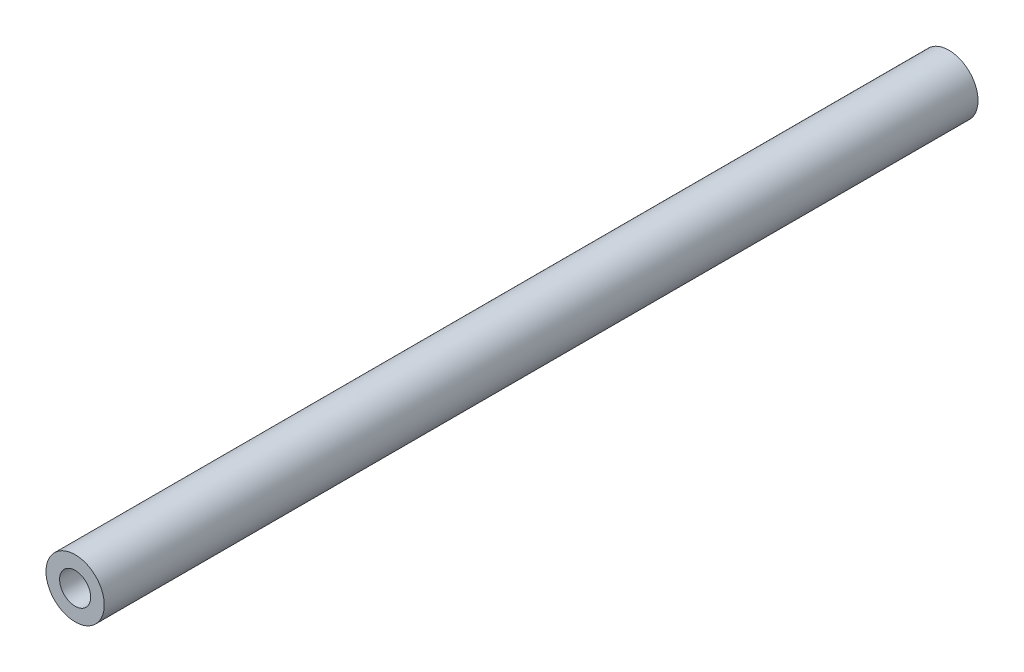
ISO-10303-21;
HEADER;
FILE_DESCRIPTION(('STEP AP214'),'2;1');
FILE_NAME('part.step','',(''),(''),'','','');
FILE_SCHEMA(('AUTOMOTIVE_DESIGN { 1 0 10303 214 1 1 1 1 }'));
ENDSEC;
DATA;
#1=APPLICATION_CONTEXT('core data for automotive mechanical design processes');
#2=APPLICATION_PROTOCOL_DEFINITION('international standard','automotive_design',2000,#1);
#3=PRODUCT_CONTEXT('',#1,'mechanical');
#4=PRODUCT('Part','Part','',(#3));
#5=PRODUCT_RELATED_PRODUCT_CATEGORY('part','',(#4));
#6=PRODUCT_DEFINITION_FORMATION('','',#4);
#7=PRODUCT_DEFINITION_CONTEXT('part definition',#1,'design');
#8=PRODUCT_DEFINITION('design','',#6,#7);
#9=PRODUCT_DEFINITION_SHAPE('','',#8);
#10=(LENGTH_UNIT() NAMED_UNIT(*) SI_UNIT(.MILLI.,.METRE.));
#11=(NAMED_UNIT(*) PLANE_ANGLE_UNIT() SI_UNIT($,.RADIAN.));
#12=(NAMED_UNIT(*) SI_UNIT($,.STERADIAN.) SOLID_ANGLE_UNIT());
#13=UNCERTAINTY_MEASURE_WITH_UNIT(LENGTH_MEASURE(1.E-05),#10,'distance_accuracy_value','');
#14=(GEOMETRIC_REPRESENTATION_CONTEXT(3) GLOBAL_UNCERTAINTY_ASSIGNED_CONTEXT((#13)) GLOBAL_UNIT_ASSIGNED_CONTEXT((#10,
#11,#12)) REPRESENTATION_CONTEXT('',''));
#15=CARTESIAN_POINT('',(0.,0.,0.));
#16=DIRECTION('',(0.,0.,1.));
#17=DIRECTION('',(1.,0.,0.));
#18=AXIS2_PLACEMENT_3D('',#15,#16,#17);
#19=CARTESIAN_POINT('',(0.,0.,90.));
#20=DIRECTION('',(0.,0.,-1.));
#21=DIRECTION('',(-1.,0.,0.));
#22=AXIS2_PLACEMENT_3D('',#19,#20,#21);
#23=CYLINDRICAL_SURFACE('',#22,3.);
#24=CARTESIAN_POINT('',(0.,0.,90.));
#25=DIRECTION('',(0.,0.,1.));
#26=DIRECTION('',(1.,0.,0.));
#27=AXIS2_PLACEMENT_3D('',#24,#25,#26);
#28=CIRCLE('',#27,3.);
#29=CARTESIAN_POINT('',(-3.,0.,90.));
#30=VERTEX_POINT('',#29);
#31=EDGE_CURVE('E10',#30,#30,#28,.T.);
#32=CARTESIAN_POINT('',(0.,0.,0.));
#33=DIRECTION('',(0.,0.,1.));
#34=DIRECTION('',(1.,0.,0.));
#35=AXIS2_PLACEMENT_3D('',#32,#33,#34);
#36=CIRCLE('',#35,3.);
#37=CARTESIAN_POINT('',(-3.,0.,0.));
#38=VERTEX_POINT('',#37);
#39=EDGE_CURVE('E40',#38,#38,#36,.T.);
#40=CARTESIAN_POINT('',(-3.,0.,90.));
#41=CARTESIAN_POINT('',(-3.,0.,89.0625));
#42=CARTESIAN_POINT('',(-3.,0.,88.125));
#43=CARTESIAN_POINT('',(-3.,0.,86.25));
#44=CARTESIAN_POINT('',(-3.,0.,85.3125));
#45=CARTESIAN_POINT('',(-3.,0.,83.4375));
#46=CARTESIAN_POINT('',(-3.,0.,82.5));
#47=CARTESIAN_POINT('',(-3.,0.,80.625));
#48=CARTESIAN_POINT('',(-3.,0.,79.6875));
#49=CARTESIAN_POINT('',(-3.,0.,77.8125));
#50=CARTESIAN_POINT('',(-3.,0.,76.875));
#51=CARTESIAN_POINT('',(-3.,0.,75.));
#52=CARTESIAN_POINT('',(-3.,0.,74.0625));
#53=CARTESIAN_POINT('',(-3.,0.,72.1875));
#54=CARTESIAN_POINT('',(-3.,0.,71.25));
#55=CARTESIAN_POINT('',(-3.,0.,69.375));
#56=CARTESIAN_POINT('',(-3.,0.,68.4375));
#57=CARTESIAN_POINT('',(-3.,0.,66.5625));
#58=CARTESIAN_POINT('',(-3.,0.,65.625));
#59=CARTESIAN_POINT('',(-3.,0.,63.75));
#60=CARTESIAN_POINT('',(-3.,0.,62.8125));
#61=CARTESIAN_POINT('',(-3.,0.,60.9375));
#62=CARTESIAN_POINT('',(-3.,0.,60.));
#63=CARTESIAN_POINT('',(-3.,0.,58.125));
#64=CARTESIAN_POINT('',(-3.,0.,57.1875));
#65=CARTESIAN_POINT('',(-3.,0.,55.3125));
#66=CARTESIAN_POINT('',(-3.,0.,54.375));
#67=CARTESIAN_POINT('',(-3.,0.,52.5));
#68=CARTESIAN_POINT('',(-3.,0.,51.5625));
#69=CARTESIAN_POINT('',(-3.,0.,49.6875));
#70=CARTESIAN_POINT('',(-3.,0.,48.75));
#71=CARTESIAN_POINT('',(-3.,0.,46.875));
#72=CARTESIAN_POINT('',(-3.,0.,45.9375));
#73=CARTESIAN_POINT('',(-3.,0.,44.0625));
#74=CARTESIAN_POINT('',(-3.,0.,43.125));
#75=CARTESIAN_POINT('',(-3.,0.,41.25));
#76=CARTESIAN_POINT('',(-3.,0.,40.3125));
#77=CARTESIAN_POINT('',(-3.,0.,38.4375));
#78=CARTESIAN_POINT('',(-3.,0.,37.5));
#79=CARTESIAN_POINT('',(-3.,0.,35.625));
#80=CARTESIAN_POINT('',(-3.,0.,34.6875));
#81=CARTESIAN_POINT('',(-3.,0.,32.8125));
#82=CARTESIAN_POINT('',(-3.,0.,31.875));
#83=CARTESIAN_POINT('',(-3.,0.,30.));
#84=CARTESIAN_POINT('',(-3.,0.,29.0625));
#85=CARTESIAN_POINT('',(-3.,0.,27.1875));
#86=CARTESIAN_POINT('',(-3.,0.,26.25));
#87=CARTESIAN_POINT('',(-3.,0.,24.375));
#88=CARTESIAN_POINT('',(-3.,0.,23.4375));
#89=CARTESIAN_POINT('',(-3.,0.,21.5625));
#90=CARTESIAN_POINT('',(-3.,0.,20.625));
#91=CARTESIAN_POINT('',(-3.,0.,18.75));
#92=CARTESIAN_POINT('',(-3.,0.,17.8125));
#93=CARTESIAN_POINT('',(-3.,0.,15.9375));
#94=CARTESIAN_POINT('',(-3.,0.,15.));
#95=CARTESIAN_POINT('',(-3.,0.,13.125));
#96=CARTESIAN_POINT('',(-3.,0.,12.1875));
#97=CARTESIAN_POINT('',(-3.,0.,10.3125));
#98=CARTESIAN_POINT('',(-3.,0.,9.37499999999999));
#99=CARTESIAN_POINT('',(-3.,0.,7.49999999999999));
#100=CARTESIAN_POINT('',(-3.,0.,6.56249999999999));
#101=CARTESIAN_POINT('',(-3.,0.,4.68749999999999));
#102=CARTESIAN_POINT('',(-3.,0.,3.74999999999998));
#103=CARTESIAN_POINT('',(-3.,0.,1.87499999999998));
#104=CARTESIAN_POINT('',(-3.,0.,0.937499999999986));
#105=CARTESIAN_POINT('',(-3.,0.,0.));
#106=B_SPLINE_CURVE_WITH_KNOTS('',3,(#40,#41,#42,#43,#44,#45,#46,#47,#48,#49,#50,#51,#52,#53,
#54,#55,#56,#57,#58,#59,#60,#61,#62,#63,#64,#65,#66,#67,#68,#69,#70,#71,#72,#73,#74,#75,#76,#77,
#78,#79,#80,#81,#82,#83,#84,#85,#86,#87,#88,#89,#90,#91,#92,#93,#94,#95,#96,#97,#98,#99,#100,
#101,#102,#103,#104,#105),.UNSPECIFIED.,.F.,.F.,(4,2,2,2,2,2,2,2,2,2,2,2,2,2,2,2,2,2,2,2,2,2,2,
2,2,2,2,2,2,2,2,2,4),(0.,2.8125,5.62499999999999,8.43749999999999,11.25,14.0625,16.875,19.6875,
22.5,25.3125,28.125,30.9375,33.75,36.5625,39.375,42.1875,45.,47.8125,50.625,53.4375,56.25,
59.0625,61.875,64.6875,67.5,70.3125,73.125,75.9375,78.75,81.5625,84.375,87.1875,90.),.UNSPECIFIED.);
#107=EDGE_CURVE('BSEAM37',#30,#38,#106,.T.);
#108=ORIENTED_EDGE('',*,*,#31,.F.);
#109=ORIENTED_EDGE('',*,*,#39,.T.);
#110=ORIENTED_EDGE('',*,*,#107,.T.);
#111=ORIENTED_EDGE('',*,*,#107,.F.);
#112=EDGE_LOOP('',(#108,#110,#109,#111));
#113=FACE_BOUND('',#112,.T.);
#114=ADVANCED_FACE('F37',(#113),#23,.T.);
#115=CARTESIAN_POINT('',(0.,0.,90.));
#116=DIRECTION('',(0.,0.,1.));
#117=DIRECTION('',(1.,0.,0.));
#118=AXIS2_PLACEMENT_3D('',#115,#116,#117);
#119=PLANE('',#118);
#120=CARTESIAN_POINT('',(0.,0.,90.));
#121=DIRECTION('',(0.,0.,1.));
#122=DIRECTION('',(1.,0.,0.));
#123=AXIS2_PLACEMENT_3D('',#120,#121,#122);
#124=CIRCLE('',#123,1.6);
#125=CARTESIAN_POINT('',(1.6,0.,90.));
#126=VERTEX_POINT('',#125);
#127=EDGE_CURVE('E51',#126,#126,#124,.T.);
#128=ORIENTED_EDGE('',*,*,#127,.F.);
#129=EDGE_LOOP('',(#128));
#130=FACE_BOUND('',#129,.T.);
#131=ORIENTED_EDGE('',*,*,#31,.T.);
#132=EDGE_LOOP('',(#131));
#133=FACE_BOUND('',#132,.T.);
#134=ADVANCED_FACE('F80',(#130,#133),#119,.T.);
#135=CARTESIAN_POINT('',(0.,0.,0.));
#136=DIRECTION('',(0.,0.,1.));
#137=DIRECTION('',(1.,0.,0.));
#138=AXIS2_PLACEMENT_3D('',#135,#136,#137);
#139=PLANE('',#138);
#140=CARTESIAN_POINT('',(0.,0.,0.));
#141=DIRECTION('',(0.,0.,-1.));
#142=DIRECTION('',(-1.,0.,0.));
#143=AXIS2_PLACEMENT_3D('',#140,#141,#142);
#144=CIRCLE('',#143,1.6);
#145=CARTESIAN_POINT('',(-1.6,0.,0.));
#146=VERTEX_POINT('',#145);
#147=EDGE_CURVE('E59',#146,#146,#144,.T.);
#148=ORIENTED_EDGE('',*,*,#147,.F.);
#149=EDGE_LOOP('',(#148));
#150=FACE_BOUND('',#149,.T.);
#151=ORIENTED_EDGE('',*,*,#39,.F.);
#152=EDGE_LOOP('',(#151));
#153=FACE_BOUND('',#152,.T.);
#154=ADVANCED_FACE('F76',(#150,#153),#139,.F.);
#155=CARTESIAN_POINT('',(0.,0.,85.5));
#156=DIRECTION('',(0.,0.,1.));
#157=DIRECTION('',(1.,0.,0.));
#158=AXIS2_PLACEMENT_3D('',#155,#156,#157);
#159=CYLINDRICAL_SURFACE('',#158,1.6);
#160=CARTESIAN_POINT('',(0.,0.,85.5));
#161=DIRECTION('',(0.,0.,1.));
#162=DIRECTION('',(1.,0.,0.));
#163=AXIS2_PLACEMENT_3D('',#160,#161,#162);
#164=CIRCLE('',#163,1.6);
#165=CARTESIAN_POINT('',(1.6,0.,85.5));
#166=VERTEX_POINT('',#165);
#167=EDGE_CURVE('E49',#166,#166,#164,.T.);
#168=ORIENTED_EDGE('',*,*,#167,.F.);
#169=EDGE_LOOP('',(#168));
#170=FACE_BOUND('',#169,.T.);
#171=ORIENTED_EDGE('',*,*,#127,.T.);
#172=EDGE_LOOP('',(#171));
#173=FACE_BOUND('',#172,.T.);
#174=ADVANCED_FACE('F79',(#170,#173),#159,.F.);
#175=CARTESIAN_POINT('',(0.,0.,85.5));
#176=DIRECTION('',(0.,0.,1.));
#177=DIRECTION('',(1.,0.,0.));
#178=AXIS2_PLACEMENT_3D('',#175,#176,#177);
#179=PLANE('',#178);
#180=ORIENTED_EDGE('',*,*,#167,.T.);
#181=EDGE_LOOP('',(#180));
#182=FACE_BOUND('',#181,.T.);
#183=ADVANCED_FACE('F72',(#182),#179,.T.);
#184=CARTESIAN_POINT('',(0.,0.,4.5));
#185=DIRECTION('',(0.,0.,-1.));
#186=DIRECTION('',(-1.,0.,0.));
#187=AXIS2_PLACEMENT_3D('',#184,#185,#186);
#188=CYLINDRICAL_SURFACE('',#187,1.6);
#189=CARTESIAN_POINT('',(0.,0.,4.5));
#190=DIRECTION('',(0.,0.,-1.));
#191=DIRECTION('',(-1.,0.,0.));
#192=AXIS2_PLACEMENT_3D('',#189,#190,#191);
#193=CIRCLE('',#192,1.6);
#194=CARTESIAN_POINT('',(-1.6,0.,4.5));
#195=VERTEX_POINT('',#194);
#196=EDGE_CURVE('E55',#195,#195,#193,.T.);
#197=ORIENTED_EDGE('',*,*,#196,.F.);
#198=EDGE_LOOP('',(#197));
#199=FACE_BOUND('',#198,.T.);
#200=ORIENTED_EDGE('',*,*,#147,.T.);
#201=EDGE_LOOP('',(#200));
#202=FACE_BOUND('',#201,.T.);
#203=ADVANCED_FACE('F69',(#199,#202),#188,.F.);
#204=CARTESIAN_POINT('',(0.,0.,4.5));
#205=DIRECTION('',(0.,0.,-1.));
#206=DIRECTION('',(-1.,0.,0.));
#207=AXIS2_PLACEMENT_3D('',#204,#205,#206);
#208=PLANE('',#207);
#209=ORIENTED_EDGE('',*,*,#196,.T.);
#210=EDGE_LOOP('',(#209));
#211=FACE_BOUND('',#210,.T.);
#212=ADVANCED_FACE('F67',(#211),#208,.T.);
#213=CLOSED_SHELL('',(#114,#134,#154,#174,#183,#203,#212));
#214=MANIFOLD_SOLID_BREP('B2',#213);
#215=ADVANCED_BREP_SHAPE_REPRESENTATION('',(#18,#214),#14);
#216=SHAPE_DEFINITION_REPRESENTATION(#9,#215);
ENDSEC;
END-ISO-10303-21;
